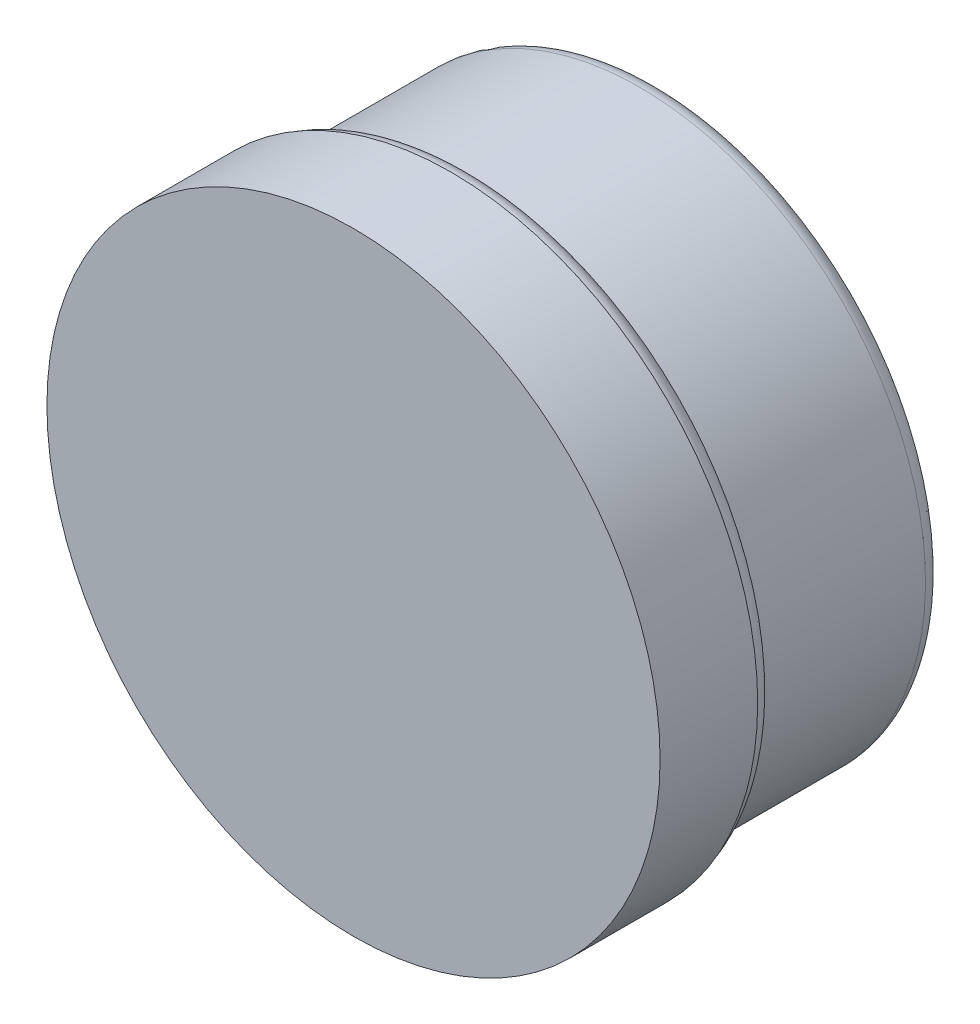
ISO-10303-21;
HEADER;
FILE_DESCRIPTION(('STEP AP214'),'2;1');
FILE_NAME('part.step','',(''),(''),'','','');
FILE_SCHEMA(('AUTOMOTIVE_DESIGN { 1 0 10303 214 1 1 1 1 }'));
ENDSEC;
DATA;
#1=APPLICATION_CONTEXT('core data for automotive mechanical design processes');
#2=APPLICATION_PROTOCOL_DEFINITION('international standard','automotive_design',2000,#1);
#3=PRODUCT_CONTEXT('',#1,'mechanical');
#4=PRODUCT('Part','Part','',(#3));
#5=PRODUCT_RELATED_PRODUCT_CATEGORY('part','',(#4));
#6=PRODUCT_DEFINITION_FORMATION('','',#4);
#7=PRODUCT_DEFINITION_CONTEXT('part definition',#1,'design');
#8=PRODUCT_DEFINITION('design','',#6,#7);
#9=PRODUCT_DEFINITION_SHAPE('','',#8);
#10=(LENGTH_UNIT() NAMED_UNIT(*) SI_UNIT(.MILLI.,.METRE.));
#11=(NAMED_UNIT(*) PLANE_ANGLE_UNIT() SI_UNIT($,.RADIAN.));
#12=(NAMED_UNIT(*) SI_UNIT($,.STERADIAN.) SOLID_ANGLE_UNIT());
#13=UNCERTAINTY_MEASURE_WITH_UNIT(LENGTH_MEASURE(1.E-05),#10,'distance_accuracy_value','');
#14=(GEOMETRIC_REPRESENTATION_CONTEXT(3) GLOBAL_UNCERTAINTY_ASSIGNED_CONTEXT((#13)) GLOBAL_UNIT_ASSIGNED_CONTEXT((#10,
#11,#12)) REPRESENTATION_CONTEXT('',''));
#15=CARTESIAN_POINT('',(0.,0.,0.));
#16=DIRECTION('',(0.,0.,1.));
#17=DIRECTION('',(1.,0.,0.));
#18=AXIS2_PLACEMENT_3D('',#15,#16,#17);
#19=CARTESIAN_POINT('',(0.,33.275,33.3));
#20=DIRECTION('',(0.,0.,-1.));
#21=DIRECTION('',(-1.,0.,0.));
#22=AXIS2_PLACEMENT_3D('',#19,#20,#21);
#23=PLANE('',#22);
#24=CARTESIAN_POINT('',(0.,0.,33.3));
#25=DIRECTION('',(0.,0.,-1.));
#26=DIRECTION('',(-1.,0.,0.));
#27=AXIS2_PLACEMENT_3D('',#24,#25,#26);
#28=CIRCLE('',#27,33.275);
#29=CARTESIAN_POINT('',(-33.275,0.,33.3));
#30=VERTEX_POINT('',#29);
#31=EDGE_CURVE('E138',#30,#30,#28,.T.);
#32=ORIENTED_EDGE('',*,*,#31,.T.);
#33=EDGE_LOOP('',(#32));
#34=FACE_BOUND('',#33,.T.);
#35=ADVANCED_FACE('F55',(#34),#23,.T.);
#36=CARTESIAN_POINT('',(0.,0.,34.8));
#37=DIRECTION('',(0.,0.,1.));
#38=DIRECTION('',(1.,0.,0.));
#39=AXIS2_PLACEMENT_3D('',#36,#37,#38);
#40=PLANE('',#39);
#41=CARTESIAN_POINT('',(0.,0.,34.8));
#42=DIRECTION('',(0.,0.,-1.));
#43=DIRECTION('',(-1.,0.,0.));
#44=AXIS2_PLACEMENT_3D('',#41,#42,#43);
#45=CIRCLE('',#44,35.025);
#46=CARTESIAN_POINT('',(-35.025,0.,34.8));
#47=VERTEX_POINT('',#46);
#48=EDGE_CURVE('E12',#47,#47,#45,.T.);
#49=ORIENTED_EDGE('',*,*,#48,.F.);
#50=EDGE_LOOP('',(#49));
#51=FACE_BOUND('',#50,.T.);
#52=ADVANCED_FACE('F173',(#51),#40,.T.);
#53=CARTESIAN_POINT('',(0.,0.,33.3));
#54=DIRECTION('',(0.,0.,-1.));
#55=DIRECTION('',(-1.,0.,0.));
#56=AXIS2_PLACEMENT_3D('',#53,#54,#55);
#57=CYLINDRICAL_SURFACE('',#56,35.025);
#58=DIRECTION('',(0.,0.,-1.));
#59=VECTOR('',#58,1.);
#60=CARTESIAN_POINT('',(9.84999999999999,-33.6114284879414,25.25));
#61=LINE('',#60,#59);
#62=CARTESIAN_POINT('',(9.84999999999999,-33.6114284879414,25.25));
#63=VERTEX_POINT('',#62);
#64=CARTESIAN_POINT('',(9.84999999999999,-33.6114284879414,23.65));
#65=VERTEX_POINT('',#64);
#66=EDGE_CURVE('E79',#63,#65,#61,.T.);
#67=ORIENTED_EDGE('',*,*,#66,.T.);
#68=CARTESIAN_POINT('',(0.,0.,23.65));
#69=DIRECTION('',(0.,0.,-1.));
#70=DIRECTION('',(-1.,0.,0.));
#71=AXIS2_PLACEMENT_3D('',#68,#69,#70);
#72=CIRCLE('',#71,35.025);
#73=CARTESIAN_POINT('',(-9.85000000000001,-33.6114284879414,23.65));
#74=VERTEX_POINT('',#73);
#75=EDGE_CURVE('E63',#74,#65,#72,.T.);
#76=ORIENTED_EDGE('',*,*,#75,.F.);
#77=DIRECTION('',(0.,0.,-1.));
#78=VECTOR('',#77,1.);
#79=CARTESIAN_POINT('',(-9.84999999999998,-33.6114284879414,25.25));
#80=LINE('',#79,#78);
#81=CARTESIAN_POINT('',(-9.84999999999998,-33.6114284879414,25.25));
#82=VERTEX_POINT('',#81);
#83=EDGE_CURVE('E110',#82,#74,#80,.T.);
#84=ORIENTED_EDGE('',*,*,#83,.F.);
#85=CARTESIAN_POINT('',(0.,0.,25.25));
#86=DIRECTION('',(0.,0.,1.));
#87=DIRECTION('',(-1.,0.,0.));
#88=AXIS2_PLACEMENT_3D('',#85,#86,#87);
#89=CIRCLE('',#88,35.025);
#90=EDGE_CURVE('E116',#82,#63,#89,.T.);
#91=ORIENTED_EDGE('',*,*,#90,.T.);
#92=EDGE_LOOP('',(#67,#76,#84,#91));
#93=FACE_BOUND('',#92,.T.);
#94=ORIENTED_EDGE('',*,*,#48,.T.);
#95=EDGE_LOOP('',(#94));
#96=FACE_BOUND('',#95,.T.);
#97=ADVANCED_FACE('F170',(#93,#96),#57,.T.);
#98=CARTESIAN_POINT('',(0.,35.025,23.65));
#99=DIRECTION('',(0.,0.,-1.));
#100=DIRECTION('',(-1.,0.,0.));
#101=AXIS2_PLACEMENT_3D('',#98,#99,#100);
#102=PLANE('',#101);
#103=ORIENTED_EDGE('',*,*,#75,.T.);
#104=CARTESIAN_POINT('',(7.42698216931315,-34.2285050923453,23.65));
#105=DIRECTION('',(0.,0.,-1.));
#106=DIRECTION('',(1.,0.,0.));
#107=AXIS2_PLACEMENT_3D('',#104,#105,#106);
#108=CIRCLE('',#107,2.50035976281994);
#109=CARTESIAN_POINT('',(8.,-36.6623188710152,23.65));
#110=VERTEX_POINT('',#109);
#111=EDGE_CURVE('E94',#65,#110,#108,.T.);
#112=ORIENTED_EDGE('',*,*,#111,.T.);
#113=CARTESIAN_POINT('',(0.,0.,23.65));
#114=DIRECTION('',(0.,0.,-1.));
#115=DIRECTION('',(1.,0.,0.));
#116=AXIS2_PLACEMENT_3D('',#113,#114,#115);
#117=CIRCLE('',#116,37.525);
#118=CARTESIAN_POINT('',(-8.,-36.6623188710152,23.65));
#119=VERTEX_POINT('',#118);
#120=EDGE_CURVE('E131',#110,#119,#117,.T.);
#121=ORIENTED_EDGE('',*,*,#120,.T.);
#122=CARTESIAN_POINT('',(-7.42698216931315,-34.2285050923453,23.65));
#123=DIRECTION('',(0.,0.,-1.));
#124=DIRECTION('',(1.,0.,0.));
#125=AXIS2_PLACEMENT_3D('',#122,#123,#124);
#126=CIRCLE('',#125,2.50035976281994);
#127=EDGE_CURVE('E70',#119,#74,#126,.T.);
#128=ORIENTED_EDGE('',*,*,#127,.T.);
#129=EDGE_LOOP('',(#103,#112,#121,#128));
#130=FACE_BOUND('',#129,.T.);
#131=CARTESIAN_POINT('',(0.,0.,23.65));
#132=DIRECTION('',(0.,0.,-1.));
#133=DIRECTION('',(-1.,0.,0.));
#134=AXIS2_PLACEMENT_3D('',#131,#132,#133);
#135=CIRCLE('',#134,33.275);
#136=CARTESIAN_POINT('',(-33.275,0.,23.65));
#137=VERTEX_POINT('',#136);
#138=EDGE_CURVE('E162',#137,#137,#135,.T.);
#139=ORIENTED_EDGE('',*,*,#138,.F.);
#140=EDGE_LOOP('',(#139));
#141=FACE_BOUND('',#140,.T.);
#142=ADVANCED_FACE('F167',(#130,#141),#102,.T.);
#143=CARTESIAN_POINT('',(0.,0.,33.3));
#144=DIRECTION('',(0.,0.,-1.));
#145=DIRECTION('',(-1.,0.,0.));
#146=AXIS2_PLACEMENT_3D('',#143,#144,#145);
#147=CYLINDRICAL_SURFACE('',#146,33.275);
#148=ORIENTED_EDGE('',*,*,#138,.T.);
#149=EDGE_LOOP('',(#148));
#150=FACE_BOUND('',#149,.T.);
#151=CARTESIAN_POINT('',(0.,0.,25.05));
#152=DIRECTION('',(0.,0.,-1.));
#153=DIRECTION('',(-1.,0.,0.));
#154=AXIS2_PLACEMENT_3D('',#151,#152,#153);
#155=CIRCLE('',#154,33.275);
#156=CARTESIAN_POINT('',(-33.275,0.,25.05));
#157=VERTEX_POINT('',#156);
#158=EDGE_CURVE('E158',#157,#157,#155,.T.);
#159=ORIENTED_EDGE('',*,*,#158,.F.);
#160=EDGE_LOOP('',(#159));
#161=FACE_BOUND('',#160,.T.);
#162=ADVANCED_FACE('F186',(#150,#161),#147,.F.);
#163=CARTESIAN_POINT('',(0.,33.275,25.05));
#164=DIRECTION('',(0.,0.,-1.));
#165=DIRECTION('',(-1.,0.,0.));
#166=AXIS2_PLACEMENT_3D('',#163,#164,#165);
#167=PLANE('',#166);
#168=ORIENTED_EDGE('',*,*,#158,.T.);
#169=EDGE_LOOP('',(#168));
#170=FACE_BOUND('',#169,.T.);
#171=CARTESIAN_POINT('',(0.,0.,25.05));
#172=DIRECTION('',(0.,0.,-1.));
#173=DIRECTION('',(-1.,0.,0.));
#174=AXIS2_PLACEMENT_3D('',#171,#172,#173);
#175=CIRCLE('',#174,32.775);
#176=CARTESIAN_POINT('',(-32.775,0.,25.05));
#177=VERTEX_POINT('',#176);
#178=EDGE_CURVE('E154',#177,#177,#175,.T.);
#179=ORIENTED_EDGE('',*,*,#178,.F.);
#180=EDGE_LOOP('',(#179));
#181=FACE_BOUND('',#180,.T.);
#182=ADVANCED_FACE('F188',(#170,#181),#167,.T.);
#183=CARTESIAN_POINT('',(0.,0.,33.3));
#184=DIRECTION('',(0.,0.,-1.));
#185=DIRECTION('',(-1.,0.,0.));
#186=AXIS2_PLACEMENT_3D('',#183,#184,#185);
#187=CYLINDRICAL_SURFACE('',#186,32.775);
#188=ORIENTED_EDGE('',*,*,#178,.T.);
#189=EDGE_LOOP('',(#188));
#190=FACE_BOUND('',#189,.T.);
#191=CARTESIAN_POINT('',(0.,0.,26.05));
#192=DIRECTION('',(0.,0.,-1.));
#193=DIRECTION('',(-1.,0.,0.));
#194=AXIS2_PLACEMENT_3D('',#191,#192,#193);
#195=CIRCLE('',#194,32.775);
#196=CARTESIAN_POINT('',(-32.775,0.,26.05));
#197=VERTEX_POINT('',#196);
#198=EDGE_CURVE('E150',#197,#197,#195,.T.);
#199=ORIENTED_EDGE('',*,*,#198,.F.);
#200=EDGE_LOOP('',(#199));
#201=FACE_BOUND('',#200,.T.);
#202=ADVANCED_FACE('F192',(#190,#201),#187,.F.);
#203=CARTESIAN_POINT('',(0.,32.775,26.05));
#204=DIRECTION('',(0.,0.,1.));
#205=DIRECTION('',(1.,0.,0.));
#206=AXIS2_PLACEMENT_3D('',#203,#204,#205);
#207=PLANE('',#206);
#208=ORIENTED_EDGE('',*,*,#198,.T.);
#209=EDGE_LOOP('',(#208));
#210=FACE_BOUND('',#209,.T.);
#211=CARTESIAN_POINT('',(0.,0.,26.05));
#212=DIRECTION('',(0.,0.,-1.));
#213=DIRECTION('',(-1.,0.,0.));
#214=AXIS2_PLACEMENT_3D('',#211,#212,#213);
#215=CIRCLE('',#214,33.275);
#216=CARTESIAN_POINT('',(-33.275,0.,26.05));
#217=VERTEX_POINT('',#216);
#218=EDGE_CURVE('E146',#217,#217,#215,.T.);
#219=ORIENTED_EDGE('',*,*,#218,.F.);
#220=EDGE_LOOP('',(#219));
#221=FACE_BOUND('',#220,.T.);
#222=ADVANCED_FACE('F196',(#210,#221),#207,.T.);
#223=CARTESIAN_POINT('',(0.,0.,33.3));
#224=DIRECTION('',(0.,0.,-1.));
#225=DIRECTION('',(-1.,0.,0.));
#226=AXIS2_PLACEMENT_3D('',#223,#224,#225);
#227=CYLINDRICAL_SURFACE('',#226,33.275);
#228=ORIENTED_EDGE('',*,*,#218,.T.);
#229=EDGE_LOOP('',(#228));
#230=FACE_BOUND('',#229,.T.);
#231=ORIENTED_EDGE('',*,*,#31,.F.);
#232=EDGE_LOOP('',(#231));
#233=FACE_BOUND('',#232,.T.);
#234=ADVANCED_FACE('F200',(#230,#233),#227,.F.);
#235=CARTESIAN_POINT('',(7.42698216931315,-34.2285050923453,25.25));
#236=DIRECTION('',(0.,0.,-1.));
#237=DIRECTION('',(-1.,0.,0.));
#238=AXIS2_PLACEMENT_3D('',#235,#236,#237);
#239=CYLINDRICAL_SURFACE('',#238,2.50035976281994);
#240=ORIENTED_EDGE('',*,*,#111,.F.);
#241=ORIENTED_EDGE('',*,*,#66,.F.);
#242=CARTESIAN_POINT('',(7.42698216931315,-34.2285050923453,25.25));
#243=DIRECTION('',(0.,0.,-1.));
#244=DIRECTION('',(1.,0.,0.));
#245=AXIS2_PLACEMENT_3D('',#242,#243,#244);
#246=CIRCLE('',#245,2.50035976281994);
#247=CARTESIAN_POINT('',(8.,-36.6623188710152,25.25));
#248=VERTEX_POINT('',#247);
#249=EDGE_CURVE('E122',#63,#248,#246,.T.);
#250=ORIENTED_EDGE('',*,*,#249,.T.);
#251=DIRECTION('',(0.,0.,-1.));
#252=VECTOR('',#251,1.);
#253=CARTESIAN_POINT('',(8.,-36.6623188710152,25.25));
#254=LINE('',#253,#252);
#255=EDGE_CURVE('E100',#248,#110,#254,.T.);
#256=ORIENTED_EDGE('',*,*,#255,.T.);
#257=EDGE_LOOP('',(#240,#241,#250,#256));
#258=FACE_BOUND('',#257,.T.);
#259=ADVANCED_FACE('F204',(#258),#239,.T.);
#260=CARTESIAN_POINT('',(-7.42698216931315,-34.2285050923453,25.25));
#261=DIRECTION('',(0.,0.,-1.));
#262=DIRECTION('',(-1.,0.,0.));
#263=AXIS2_PLACEMENT_3D('',#260,#261,#262);
#264=CYLINDRICAL_SURFACE('',#263,2.50035976281994);
#265=ORIENTED_EDGE('',*,*,#127,.F.);
#266=DIRECTION('',(0.,0.,-1.));
#267=VECTOR('',#266,1.);
#268=CARTESIAN_POINT('',(-8.,-36.6623188710152,25.25));
#269=LINE('',#268,#267);
#270=CARTESIAN_POINT('',(-8.,-36.6623188710152,25.25));
#271=VERTEX_POINT('',#270);
#272=EDGE_CURVE('E104',#271,#119,#269,.T.);
#273=ORIENTED_EDGE('',*,*,#272,.F.);
#274=CARTESIAN_POINT('',(-7.42698216931315,-34.2285050923453,25.25));
#275=DIRECTION('',(0.,0.,-1.));
#276=DIRECTION('',(1.,0.,0.));
#277=AXIS2_PLACEMENT_3D('',#274,#275,#276);
#278=CIRCLE('',#277,2.50035976281994);
#279=EDGE_CURVE('E107',#271,#82,#278,.T.);
#280=ORIENTED_EDGE('',*,*,#279,.T.);
#281=ORIENTED_EDGE('',*,*,#83,.T.);
#282=EDGE_LOOP('',(#265,#273,#280,#281));
#283=FACE_BOUND('',#282,.T.);
#284=ADVANCED_FACE('F106',(#283),#264,.T.);
#285=CARTESIAN_POINT('',(0.,0.,25.25));
#286=DIRECTION('',(0.,0.,-1.));
#287=DIRECTION('',(-1.,0.,0.));
#288=AXIS2_PLACEMENT_3D('',#285,#286,#287);
#289=CYLINDRICAL_SURFACE('',#288,37.525);
#290=ORIENTED_EDGE('',*,*,#120,.F.);
#291=ORIENTED_EDGE('',*,*,#255,.F.);
#292=CARTESIAN_POINT('',(0.,0.,25.25));
#293=DIRECTION('',(0.,0.,-1.));
#294=DIRECTION('',(1.,0.,0.));
#295=AXIS2_PLACEMENT_3D('',#292,#293,#294);
#296=CIRCLE('',#295,37.525);
#297=EDGE_CURVE('E114',#248,#271,#296,.T.);
#298=ORIENTED_EDGE('',*,*,#297,.T.);
#299=ORIENTED_EDGE('',*,*,#272,.T.);
#300=EDGE_LOOP('',(#290,#291,#298,#299));
#301=FACE_BOUND('',#300,.T.);
#302=ADVANCED_FACE('F120',(#301),#289,.T.);
#303=CARTESIAN_POINT('',(3.71349108465657,-17.1142525461726,25.25));
#304=DIRECTION('',(0.,0.,1.));
#305=DIRECTION('',(1.,0.,0.));
#306=AXIS2_PLACEMENT_3D('',#303,#304,#305);
#307=PLANE('',#306);
#308=ORIENTED_EDGE('',*,*,#249,.F.);
#309=ORIENTED_EDGE('',*,*,#90,.F.);
#310=ORIENTED_EDGE('',*,*,#279,.F.);
#311=ORIENTED_EDGE('',*,*,#297,.F.);
#312=EDGE_LOOP('',(#308,#309,#310,#311));
#313=FACE_BOUND('',#312,.T.);
#314=ADVANCED_FACE('F113',(#313),#307,.T.);
#315=CLOSED_SHELL('',(#35,#52,#97,#142,#162,#182,#202,#222,#234,#259,#284,#302,#314));
#316=MANIFOLD_SOLID_BREP('B2',#315);
#317=CARTESIAN_POINT('',(0.,0.,0.));
#318=DIRECTION('',(0.,0.,1.));
#319=DIRECTION('',(0.,-1.,0.));
#320=AXIS2_PLACEMENT_3D('',#317,#318,#319);
#321=PLANE('',#320);
#322=CARTESIAN_POINT('',(0.,0.,0.));
#323=DIRECTION('',(0.,0.,1.));
#324=DIRECTION('',(0.,-1.,0.));
#325=AXIS2_PLACEMENT_3D('',#322,#323,#324);
#326=CIRCLE('',#325,30.55);
#327=CARTESIAN_POINT('',(0.,-30.55,0.));
#328=VERTEX_POINT('',#327);
#329=EDGE_CURVE('E54',#328,#328,#326,.T.);
#330=ORIENTED_EDGE('',*,*,#329,.F.);
#331=EDGE_LOOP('',(#330));
#332=FACE_BOUND('',#331,.T.);
#333=ADVANCED_FACE('F306',(#332),#321,.F.);
#334=CARTESIAN_POINT('',(0.,0.,2.1));
#335=DIRECTION('',(0.,0.,1.));
#336=DIRECTION('',(0.,-1.,0.));
#337=AXIS2_PLACEMENT_3D('',#334,#335,#336);
#338=TOROIDAL_SURFACE('',#337,30.55,2.1);
#339=CARTESIAN_POINT('',(0.,0.,2.1));
#340=DIRECTION('',(0.,0.,1.));
#341=DIRECTION('',(0.,-1.,0.));
#342=AXIS2_PLACEMENT_3D('',#339,#340,#341);
#343=CIRCLE('',#342,32.65);
#344=CARTESIAN_POINT('',(0.,-32.65,2.1));
#345=VERTEX_POINT('',#344);
#346=EDGE_CURVE('E312',#345,#345,#343,.T.);
#347=ORIENTED_EDGE('',*,*,#346,.F.);
#348=EDGE_LOOP('',(#347));
#349=FACE_BOUND('',#348,.T.);
#350=ORIENTED_EDGE('',*,*,#329,.T.);
#351=EDGE_LOOP('',(#350));
#352=FACE_BOUND('',#351,.T.);
#353=ADVANCED_FACE('F435',(#349,#352),#338,.T.);
#354=CARTESIAN_POINT('',(0.,0.,1.5));
#355=DIRECTION('',(0.,0.,1.));
#356=DIRECTION('',(0.,-1.,0.));
#357=AXIS2_PLACEMENT_3D('',#354,#355,#356);
#358=CYLINDRICAL_SURFACE('',#357,32.65);
#359=CARTESIAN_POINT('',(0.,0.,21.5));
#360=DIRECTION('',(0.,0.,1.));
#361=DIRECTION('',(0.,-1.,0.));
#362=AXIS2_PLACEMENT_3D('',#359,#360,#361);
#363=CIRCLE('',#362,32.65);
#364=CARTESIAN_POINT('',(0.,-32.65,21.5));
#365=VERTEX_POINT('',#364);
#366=EDGE_CURVE('E316',#365,#365,#363,.T.);
#367=ORIENTED_EDGE('',*,*,#366,.F.);
#368=EDGE_LOOP('',(#367));
#369=FACE_BOUND('',#368,.T.);
#370=ORIENTED_EDGE('',*,*,#346,.T.);
#371=EDGE_LOOP('',(#370));
#372=FACE_BOUND('',#371,.T.);
#373=ADVANCED_FACE('F430',(#369,#372),#358,.T.);
#374=CARTESIAN_POINT('',(0.,32.65,21.5));
#375=DIRECTION('',(0.,0.,1.));
#376=DIRECTION('',(0.,-1.,0.));
#377=AXIS2_PLACEMENT_3D('',#374,#375,#376);
#378=PLANE('',#377);
#379=CARTESIAN_POINT('',(0.,0.,21.5));
#380=DIRECTION('',(0.,0.,1.));
#381=DIRECTION('',(0.,-1.,0.));
#382=AXIS2_PLACEMENT_3D('',#379,#380,#381);
#383=CIRCLE('',#382,32.85);
#384=CARTESIAN_POINT('',(0.,-32.85,21.5));
#385=VERTEX_POINT('',#384);
#386=EDGE_CURVE('E320',#385,#385,#383,.T.);
#387=ORIENTED_EDGE('',*,*,#386,.F.);
#388=EDGE_LOOP('',(#387));
#389=FACE_BOUND('',#388,.T.);
#390=ORIENTED_EDGE('',*,*,#366,.T.);
#391=EDGE_LOOP('',(#390));
#392=FACE_BOUND('',#391,.T.);
#393=ADVANCED_FACE('F424',(#389,#392),#378,.F.);
#394=CARTESIAN_POINT('',(0.,0.,23.5));
#395=DIRECTION('',(0.,0.,1.));
#396=DIRECTION('',(0.,-1.,0.));
#397=AXIS2_PLACEMENT_3D('',#394,#395,#396);
#398=TOROIDAL_SURFACE('',#397,32.85,2.);
#399=CARTESIAN_POINT('',(0.,0.,23.5));
#400=DIRECTION('',(0.,0.,1.));
#401=DIRECTION('',(0.,-1.,0.));
#402=AXIS2_PLACEMENT_3D('',#399,#400,#401);
#403=CIRCLE('',#402,34.85);
#404=CARTESIAN_POINT('',(0.,-34.85,23.5));
#405=VERTEX_POINT('',#404);
#406=EDGE_CURVE('E325',#405,#405,#403,.T.);
#407=ORIENTED_EDGE('',*,*,#406,.F.);
#408=EDGE_LOOP('',(#407));
#409=FACE_BOUND('',#408,.T.);
#410=ORIENTED_EDGE('',*,*,#386,.T.);
#411=EDGE_LOOP('',(#410));
#412=FACE_BOUND('',#411,.T.);
#413=ADVANCED_FACE('F418',(#409,#412),#398,.T.);
#414=CARTESIAN_POINT('',(0.,0.,1.5));
#415=DIRECTION('',(0.,0.,1.));
#416=DIRECTION('',(0.,-1.,0.));
#417=AXIS2_PLACEMENT_3D('',#414,#415,#416);
#418=CYLINDRICAL_SURFACE('',#417,34.85);
#419=CARTESIAN_POINT('',(0.,0.,23.55));
#420=DIRECTION('',(0.,0.,1.));
#421=DIRECTION('',(0.,-1.,0.));
#422=AXIS2_PLACEMENT_3D('',#419,#420,#421);
#423=CIRCLE('',#422,34.85);
#424=CARTESIAN_POINT('',(0.,-34.85,23.55));
#425=VERTEX_POINT('',#424);
#426=EDGE_CURVE('E328',#425,#425,#423,.T.);
#427=ORIENTED_EDGE('',*,*,#426,.F.);
#428=EDGE_LOOP('',(#427));
#429=FACE_BOUND('',#428,.T.);
#430=ORIENTED_EDGE('',*,*,#406,.T.);
#431=EDGE_LOOP('',(#430));
#432=FACE_BOUND('',#431,.T.);
#433=ADVANCED_FACE('F412',(#429,#432),#418,.T.);
#434=CARTESIAN_POINT('',(0.,34.85,23.55));
#435=DIRECTION('',(0.,0.,-1.));
#436=DIRECTION('',(0.,1.,0.));
#437=AXIS2_PLACEMENT_3D('',#434,#435,#436);
#438=PLANE('',#437);
#439=CARTESIAN_POINT('',(0.,0.,23.55));
#440=DIRECTION('',(0.,0.,1.));
#441=DIRECTION('',(0.,-1.,0.));
#442=AXIS2_PLACEMENT_3D('',#439,#440,#441);
#443=CIRCLE('',#442,32.65);
#444=CARTESIAN_POINT('',(0.,-32.65,23.55));
#445=VERTEX_POINT('',#444);
#446=EDGE_CURVE('E331',#445,#445,#443,.T.);
#447=ORIENTED_EDGE('',*,*,#446,.F.);
#448=EDGE_LOOP('',(#447));
#449=FACE_BOUND('',#448,.T.);
#450=ORIENTED_EDGE('',*,*,#426,.T.);
#451=EDGE_LOOP('',(#450));
#452=FACE_BOUND('',#451,.T.);
#453=ADVANCED_FACE('F406',(#449,#452),#438,.F.);
#454=CARTESIAN_POINT('',(0.,0.,1.5));
#455=DIRECTION('',(0.,0.,1.));
#456=DIRECTION('',(0.,-1.,0.));
#457=AXIS2_PLACEMENT_3D('',#454,#455,#456);
#458=CYLINDRICAL_SURFACE('',#457,32.65);
#459=CARTESIAN_POINT('',(0.,0.,26.5));
#460=DIRECTION('',(0.,0.,1.));
#461=DIRECTION('',(0.,-1.,0.));
#462=AXIS2_PLACEMENT_3D('',#459,#460,#461);
#463=CIRCLE('',#462,32.65);
#464=CARTESIAN_POINT('',(0.,-32.65,26.5));
#465=VERTEX_POINT('',#464);
#466=EDGE_CURVE('E334',#465,#465,#463,.T.);
#467=ORIENTED_EDGE('',*,*,#466,.F.);
#468=EDGE_LOOP('',(#467));
#469=FACE_BOUND('',#468,.T.);
#470=ORIENTED_EDGE('',*,*,#446,.T.);
#471=EDGE_LOOP('',(#470));
#472=FACE_BOUND('',#471,.T.);
#473=ADVANCED_FACE('F400',(#469,#472),#458,.T.);
#474=CARTESIAN_POINT('',(0.,32.65,26.5));
#475=DIRECTION('',(0.,0.,1.));
#476=DIRECTION('',(0.,-1.,0.));
#477=AXIS2_PLACEMENT_3D('',#474,#475,#476);
#478=PLANE('',#477);
#479=CARTESIAN_POINT('',(0.,0.,26.5));
#480=DIRECTION('',(0.,0.,1.));
#481=DIRECTION('',(0.,-1.,0.));
#482=AXIS2_PLACEMENT_3D('',#479,#480,#481);
#483=CIRCLE('',#482,33.25);
#484=CARTESIAN_POINT('',(0.,-33.25,26.5));
#485=VERTEX_POINT('',#484);
#486=EDGE_CURVE('E337',#485,#485,#483,.T.);
#487=ORIENTED_EDGE('',*,*,#486,.F.);
#488=EDGE_LOOP('',(#487));
#489=FACE_BOUND('',#488,.T.);
#490=ORIENTED_EDGE('',*,*,#466,.T.);
#491=EDGE_LOOP('',(#490));
#492=FACE_BOUND('',#491,.T.);
#493=ADVANCED_FACE('F394',(#489,#492),#478,.F.);
#494=CARTESIAN_POINT('',(0.,0.,1.5));
#495=DIRECTION('',(0.,0.,1.));
#496=DIRECTION('',(0.,-1.,0.));
#497=AXIS2_PLACEMENT_3D('',#494,#495,#496);
#498=CYLINDRICAL_SURFACE('',#497,33.25);
#499=CARTESIAN_POINT('',(0.,0.,27.7));
#500=DIRECTION('',(0.,0.,1.));
#501=DIRECTION('',(0.,-1.,0.));
#502=AXIS2_PLACEMENT_3D('',#499,#500,#501);
#503=CIRCLE('',#502,33.25);
#504=CARTESIAN_POINT('',(0.,-33.25,27.7));
#505=VERTEX_POINT('',#504);
#506=EDGE_CURVE('E340',#505,#505,#503,.T.);
#507=ORIENTED_EDGE('',*,*,#506,.F.);
#508=EDGE_LOOP('',(#507));
#509=FACE_BOUND('',#508,.T.);
#510=ORIENTED_EDGE('',*,*,#486,.T.);
#511=EDGE_LOOP('',(#510));
#512=FACE_BOUND('',#511,.T.);
#513=ADVANCED_FACE('F388',(#509,#512),#498,.T.);
#514=CARTESIAN_POINT('',(0.,33.25,27.7));
#515=DIRECTION('',(0.,0.,-1.));
#516=DIRECTION('',(0.,1.,0.));
#517=AXIS2_PLACEMENT_3D('',#514,#515,#516);
#518=PLANE('',#517);
#519=CARTESIAN_POINT('',(0.,0.,27.7));
#520=DIRECTION('',(0.,0.,1.));
#521=DIRECTION('',(0.,-1.,0.));
#522=AXIS2_PLACEMENT_3D('',#519,#520,#521);
#523=CIRCLE('',#522,32.65);
#524=CARTESIAN_POINT('',(0.,-32.65,27.7));
#525=VERTEX_POINT('',#524);
#526=EDGE_CURVE('E343',#525,#525,#523,.T.);
#527=ORIENTED_EDGE('',*,*,#526,.F.);
#528=EDGE_LOOP('',(#527));
#529=FACE_BOUND('',#528,.T.);
#530=ORIENTED_EDGE('',*,*,#506,.T.);
#531=EDGE_LOOP('',(#530));
#532=FACE_BOUND('',#531,.T.);
#533=ADVANCED_FACE('F382',(#529,#532),#518,.F.);
#534=CARTESIAN_POINT('',(0.,0.,1.5));
#535=DIRECTION('',(0.,0.,1.));
#536=DIRECTION('',(0.,-1.,0.));
#537=AXIS2_PLACEMENT_3D('',#534,#535,#536);
#538=CYLINDRICAL_SURFACE('',#537,32.65);
#539=CARTESIAN_POINT('',(0.,0.,29.));
#540=DIRECTION('',(0.,0.,1.));
#541=DIRECTION('',(0.,-1.,0.));
#542=AXIS2_PLACEMENT_3D('',#539,#540,#541);
#543=CIRCLE('',#542,32.65);
#544=CARTESIAN_POINT('',(0.,-32.65,29.));
#545=VERTEX_POINT('',#544);
#546=EDGE_CURVE('E346',#545,#545,#543,.T.);
#547=ORIENTED_EDGE('',*,*,#546,.F.);
#548=EDGE_LOOP('',(#547));
#549=FACE_BOUND('',#548,.T.);
#550=ORIENTED_EDGE('',*,*,#526,.T.);
#551=EDGE_LOOP('',(#550));
#552=FACE_BOUND('',#551,.T.);
#553=ADVANCED_FACE('F376',(#549,#552),#538,.T.);
#554=CARTESIAN_POINT('',(0.,32.65,29.));
#555=DIRECTION('',(0.,0.,-1.));
#556=DIRECTION('',(0.,1.,0.));
#557=AXIS2_PLACEMENT_3D('',#554,#555,#556);
#558=PLANE('',#557);
#559=CARTESIAN_POINT('',(0.,0.,29.));
#560=DIRECTION('',(0.,0.,1.));
#561=DIRECTION('',(0.,-1.,0.));
#562=AXIS2_PLACEMENT_3D('',#559,#560,#561);
#563=CIRCLE('',#562,31.15);
#564=CARTESIAN_POINT('',(0.,-31.15,29.));
#565=VERTEX_POINT('',#564);
#566=EDGE_CURVE('E349',#565,#565,#563,.T.);
#567=ORIENTED_EDGE('',*,*,#566,.F.);
#568=EDGE_LOOP('',(#567));
#569=FACE_BOUND('',#568,.T.);
#570=ORIENTED_EDGE('',*,*,#546,.T.);
#571=EDGE_LOOP('',(#570));
#572=FACE_BOUND('',#571,.T.);
#573=ADVANCED_FACE('F370',(#569,#572),#558,.F.);
#574=CARTESIAN_POINT('',(0.,0.,1.5));
#575=DIRECTION('',(0.,0.,1.));
#576=DIRECTION('',(0.,-1.,0.));
#577=AXIS2_PLACEMENT_3D('',#574,#575,#576);
#578=CYLINDRICAL_SURFACE('',#577,31.15);
#579=CARTESIAN_POINT('',(0.,0.,3.));
#580=DIRECTION('',(0.,0.,1.));
#581=DIRECTION('',(0.,-1.,0.));
#582=AXIS2_PLACEMENT_3D('',#579,#580,#581);
#583=CIRCLE('',#582,31.15);
#584=CARTESIAN_POINT('',(0.,-31.15,3.));
#585=VERTEX_POINT('',#584);
#586=EDGE_CURVE('E352',#585,#585,#583,.T.);
#587=ORIENTED_EDGE('',*,*,#586,.F.);
#588=EDGE_LOOP('',(#587));
#589=FACE_BOUND('',#588,.T.);
#590=ORIENTED_EDGE('',*,*,#566,.T.);
#591=EDGE_LOOP('',(#590));
#592=FACE_BOUND('',#591,.T.);
#593=ADVANCED_FACE('F364',(#589,#592),#578,.F.);
#594=CARTESIAN_POINT('',(0.,0.,3.));
#595=DIRECTION('',(0.,0.,1.));
#596=DIRECTION('',(0.,-1.,0.));
#597=AXIS2_PLACEMENT_3D('',#594,#595,#596);
#598=TOROIDAL_SURFACE('',#597,29.65,1.5);
#599=CARTESIAN_POINT('',(0.,0.,1.5));
#600=DIRECTION('',(0.,0.,1.));
#601=DIRECTION('',(0.,-1.,0.));
#602=AXIS2_PLACEMENT_3D('',#599,#600,#601);
#603=CIRCLE('',#602,29.65);
#604=CARTESIAN_POINT('',(0.,-29.65,1.5));
#605=VERTEX_POINT('',#604);
#606=EDGE_CURVE('E355',#605,#605,#603,.T.);
#607=ORIENTED_EDGE('',*,*,#606,.F.);
#608=EDGE_LOOP('',(#607));
#609=FACE_BOUND('',#608,.T.);
#610=ORIENTED_EDGE('',*,*,#586,.T.);
#611=EDGE_LOOP('',(#610));
#612=FACE_BOUND('',#611,.T.);
#613=ADVANCED_FACE('F361',(#609,#612),#598,.F.);
#614=CARTESIAN_POINT('',(0.,29.65,1.5));
#615=DIRECTION('',(0.,0.,-1.));
#616=DIRECTION('',(0.,1.,0.));
#617=AXIS2_PLACEMENT_3D('',#614,#615,#616);
#618=PLANE('',#617);
#619=ORIENTED_EDGE('',*,*,#606,.T.);
#620=EDGE_LOOP('',(#619));
#621=FACE_BOUND('',#620,.T.);
#622=ADVANCED_FACE('F359',(#621),#618,.F.);
#623=CLOSED_SHELL('',(#333,#353,#373,#393,#413,#433,#453,#473,#493,#513,#533,#553,#573,#593,
#613,#622));
#624=MANIFOLD_SOLID_BREP('B6',#623);
#625=ADVANCED_BREP_SHAPE_REPRESENTATION('',(#18,#316,#624),#14);
#626=SHAPE_DEFINITION_REPRESENTATION(#9,#625);
ENDSEC;
END-ISO-10303-21;
